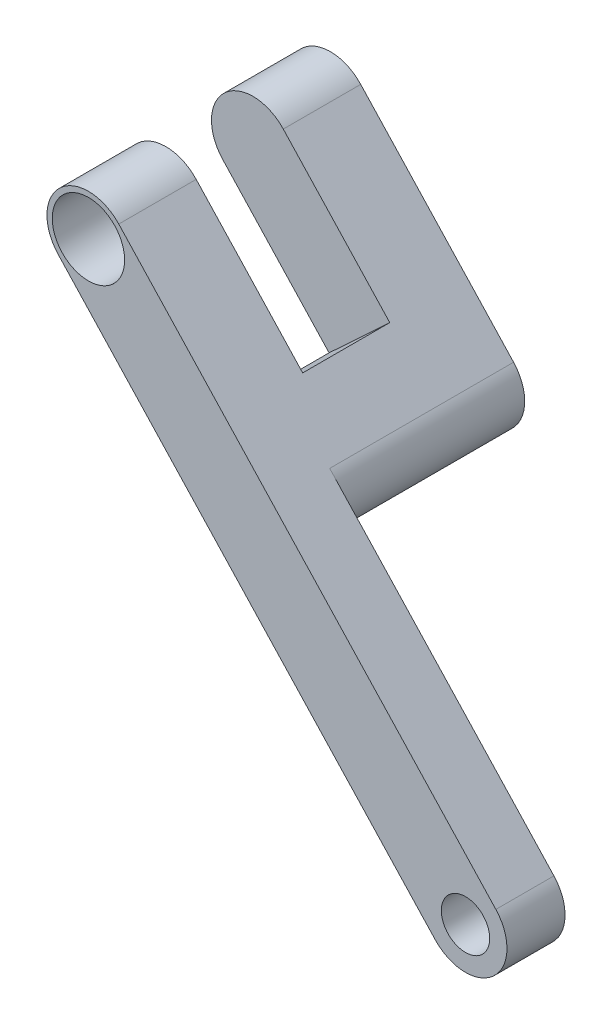
ISO-10303-21;
HEADER;
FILE_DESCRIPTION(('STEP AP214'),'2;1');
FILE_NAME('part.step','',(''),(''),'','','');
FILE_SCHEMA(('AUTOMOTIVE_DESIGN { 1 0 10303 214 1 1 1 1 }'));
ENDSEC;
DATA;
#1=APPLICATION_CONTEXT('core data for automotive mechanical design processes');
#2=APPLICATION_PROTOCOL_DEFINITION('international standard','automotive_design',2000,#1);
#3=PRODUCT_CONTEXT('',#1,'mechanical');
#4=PRODUCT('Part','Part','',(#3));
#5=PRODUCT_RELATED_PRODUCT_CATEGORY('part','',(#4));
#6=PRODUCT_DEFINITION_FORMATION('','',#4);
#7=PRODUCT_DEFINITION_CONTEXT('part definition',#1,'design');
#8=PRODUCT_DEFINITION('design','',#6,#7);
#9=PRODUCT_DEFINITION_SHAPE('','',#8);
#10=(LENGTH_UNIT() NAMED_UNIT(*) SI_UNIT(.MILLI.,.METRE.));
#11=(NAMED_UNIT(*) PLANE_ANGLE_UNIT() SI_UNIT($,.RADIAN.));
#12=(NAMED_UNIT(*) SI_UNIT($,.STERADIAN.) SOLID_ANGLE_UNIT());
#13=UNCERTAINTY_MEASURE_WITH_UNIT(LENGTH_MEASURE(1.E-05),#10,'distance_accuracy_value','');
#14=(GEOMETRIC_REPRESENTATION_CONTEXT(3) GLOBAL_UNCERTAINTY_ASSIGNED_CONTEXT((#13)) GLOBAL_UNIT_ASSIGNED_CONTEXT((#10,
#11,#12)) REPRESENTATION_CONTEXT('',''));
#15=CARTESIAN_POINT('',(0.,0.,0.));
#16=DIRECTION('',(0.,0.,1.));
#17=DIRECTION('',(1.,0.,0.));
#18=AXIS2_PLACEMENT_3D('',#15,#16,#17);
#19=CARTESIAN_POINT('',(27.7336179918947,-37.6650889723921,4.));
#20=DIRECTION('',(0.,0.,-1.));
#21=DIRECTION('',(-1.,0.,0.));
#22=AXIS2_PLACEMENT_3D('',#19,#20,#21);
#23=CYLINDRICAL_SURFACE('',#22,2.14240467091107);
#24=CARTESIAN_POINT('',(27.7336179918947,-37.6650889723921,1.));
#25=DIRECTION('',(0.,0.,1.));
#26=DIRECTION('',(1.,0.,0.));
#27=AXIS2_PLACEMENT_3D('',#24,#25,#26);
#28=CIRCLE('',#27,2.14240467091107);
#29=CARTESIAN_POINT('',(26.1656181410229,-39.1249774070362,1.));
#30=VERTEX_POINT('',#29);
#31=CARTESIAN_POINT('',(29.3016178427665,-36.205200537748,1.));
#32=VERTEX_POINT('',#31);
#33=EDGE_CURVE('E129',#30,#32,#28,.T.);
#34=ORIENTED_EDGE('',*,*,#33,.F.);
#35=DIRECTION('',(0.,0.,-1.));
#36=VECTOR('',#35,1.);
#37=CARTESIAN_POINT('',(26.1656181410229,-39.1249774070362,4.));
#38=LINE('',#37,#36);
#39=CARTESIAN_POINT('',(26.1656181410229,-39.1249774070362,-8.5));
#40=VERTEX_POINT('',#39);
#41=EDGE_CURVE('E45',#30,#40,#38,.T.);
#42=ORIENTED_EDGE('',*,*,#41,.T.);
#43=CARTESIAN_POINT('',(27.7336179918947,-37.6650889723921,-8.5));
#44=DIRECTION('',(0.,0.,-1.));
#45=DIRECTION('',(-1.,0.,0.));
#46=AXIS2_PLACEMENT_3D('',#43,#44,#45);
#47=CIRCLE('',#46,2.14240467091107);
#48=CARTESIAN_POINT('',(29.3016178427665,-36.205200537748,-8.5));
#49=VERTEX_POINT('',#48);
#50=EDGE_CURVE('E146',#49,#40,#47,.T.);
#51=ORIENTED_EDGE('',*,*,#50,.F.);
#52=DIRECTION('',(0.,0.,-1.));
#53=VECTOR('',#52,1.);
#54=CARTESIAN_POINT('',(29.3016178427665,-36.205200537748,4.));
#55=LINE('',#54,#53);
#56=EDGE_CURVE('E201',#32,#49,#55,.T.);
#57=ORIENTED_EDGE('',*,*,#56,.F.);
#58=EDGE_LOOP('',(#34,#42,#51,#57));
#59=FACE_BOUND('',#58,.T.);
#60=ADVANCED_FACE('F37',(#59),#23,.T.);
#61=CARTESIAN_POINT('',(19.8350002480584,-29.1815424557379,0.));
#62=DIRECTION('',(0.,0.,1.));
#63=DIRECTION('',(1.,0.,0.));
#64=AXIS2_PLACEMENT_3D('',#61,#62,#63);
#65=PLANE('',#64);
#66=CARTESIAN_POINT('',(19.8350002480584,-29.1815424557379,0.));
#67=DIRECTION('',(0.,0.,1.));
#68=DIRECTION('',(1.,0.,0.));
#69=AXIS2_PLACEMENT_3D('',#66,#67,#68);
#70=CIRCLE('',#69,1.86939448326171);
#71=CARTESIAN_POINT('',(21.7043947313201,-29.1815424557379,0.));
#72=VERTEX_POINT('',#71);
#73=EDGE_CURVE('E179',#72,#72,#70,.T.);
#74=ORIENTED_EDGE('',*,*,#73,.T.);
#75=EDGE_LOOP('',(#74));
#76=FACE_BOUND('',#75,.T.);
#77=DIRECTION('',(0.731887804466461,0.681425154858011,0.));
#78=VECTOR('',#77,1.);
#79=CARTESIAN_POINT('',(23.7688324008696,-36.5506987197417,0.));
#80=LINE('',#79,#78);
#81=CARTESIAN_POINT('',(23.7688324008696,-36.5506987197417,0.));
#82=VERTEX_POINT('',#81);
#83=CARTESIAN_POINT('',(26.9048321026132,-33.6309218504535,0.));
#84=VERTEX_POINT('',#83);
#85=EDGE_CURVE('E60',#82,#84,#80,.T.);
#86=ORIENTED_EDGE('',*,*,#85,.F.);
#87=DIRECTION('',(0.681425154858011,-0.73188780446646,0.));
#88=VECTOR('',#87,1.);
#89=CARTESIAN_POINT('',(18.2670003971866,-30.641430890382,0.));
#90=LINE('',#89,#88);
#91=CARTESIAN_POINT('',(18.2670003971866,-30.641430890382,0.));
#92=VERTEX_POINT('',#91);
#93=EDGE_CURVE('E196',#92,#82,#90,.T.);
#94=ORIENTED_EDGE('',*,*,#93,.F.);
#95=CARTESIAN_POINT('',(19.8350002480584,-29.1815424557379,0.));
#96=DIRECTION('',(0.,0.,1.));
#97=DIRECTION('',(1.,0.,0.));
#98=AXIS2_PLACEMENT_3D('',#95,#96,#97);
#99=CIRCLE('',#98,2.14240467091107);
#100=CARTESIAN_POINT('',(21.4030000989302,-27.7216540210938,0.));
#101=VERTEX_POINT('',#100);
#102=EDGE_CURVE('E183',#101,#92,#99,.T.);
#103=ORIENTED_EDGE('',*,*,#102,.F.);
#104=DIRECTION('',(-0.681425154858011,0.731887804466461,0.));
#105=VECTOR('',#104,1.);
#106=CARTESIAN_POINT('',(21.4030000989302,-27.7216540210938,0.));
#107=LINE('',#106,#105);
#108=EDGE_CURVE('E190',#84,#101,#107,.T.);
#109=ORIENTED_EDGE('',*,*,#108,.F.);
#110=EDGE_LOOP('',(#86,#94,#103,#109));
#111=FACE_BOUND('',#110,.T.);
#112=ADVANCED_FACE('F227',(#76,#111),#65,.F.);
#113=CARTESIAN_POINT('',(19.8350002480584,-29.1815424557379,4.));
#114=DIRECTION('',(0.,0.,1.));
#115=DIRECTION('',(1.,0.,0.));
#116=AXIS2_PLACEMENT_3D('',#113,#114,#115);
#117=PLANE('',#116);
#118=DIRECTION('',(0.681425154858011,-0.73188780446646,0.));
#119=VECTOR('',#118,1.);
#120=CARTESIAN_POINT('',(18.2670003971866,-30.641430890382,4.));
#121=LINE('',#120,#119);
#122=CARTESIAN_POINT('',(18.2670003971866,-30.641430890382,4.));
#123=VERTEX_POINT('',#122);
#124=CARTESIAN_POINT('',(37.7498457736091,-51.567070082966,4.));
#125=VERTEX_POINT('',#124);
#126=EDGE_CURVE('E189',#123,#125,#121,.T.);
#127=ORIENTED_EDGE('',*,*,#126,.T.);
#128=CARTESIAN_POINT('',(39.3178456244809,-50.1071816483219,4.));
#129=DIRECTION('',(0.,0.,1.));
#130=DIRECTION('',(1.,0.,0.));
#131=AXIS2_PLACEMENT_3D('',#128,#129,#130);
#132=CIRCLE('',#131,2.14240467091107);
#133=CARTESIAN_POINT('',(40.8858454753527,-48.6472932136778,4.));
#134=VERTEX_POINT('',#133);
#135=EDGE_CURVE('E134',#125,#134,#132,.T.);
#136=ORIENTED_EDGE('',*,*,#135,.T.);
#137=DIRECTION('',(-0.681425154858011,0.731887804466461,0.));
#138=VECTOR('',#137,1.);
#139=CARTESIAN_POINT('',(21.4030000989302,-27.7216540210938,4.));
#140=LINE('',#139,#138);
#141=CARTESIAN_POINT('',(21.4030000989302,-27.7216540210938,4.));
#142=VERTEX_POINT('',#141);
#143=EDGE_CURVE('E115',#134,#142,#140,.T.);
#144=ORIENTED_EDGE('',*,*,#143,.T.);
#145=CARTESIAN_POINT('',(19.8350002480584,-29.1815424557379,4.));
#146=DIRECTION('',(0.,0.,1.));
#147=DIRECTION('',(1.,0.,0.));
#148=AXIS2_PLACEMENT_3D('',#145,#146,#147);
#149=CIRCLE('',#148,2.14240467091107);
#150=EDGE_CURVE('E186',#142,#123,#149,.T.);
#151=ORIENTED_EDGE('',*,*,#150,.T.);
#152=EDGE_LOOP('',(#127,#136,#144,#151));
#153=FACE_BOUND('',#152,.T.);
#154=CARTESIAN_POINT('',(19.8350002480584,-29.1815424557379,4.));
#155=DIRECTION('',(0.,0.,1.));
#156=DIRECTION('',(1.,0.,0.));
#157=AXIS2_PLACEMENT_3D('',#154,#155,#156);
#158=CIRCLE('',#157,1.86939448326171);
#159=CARTESIAN_POINT('',(21.7043947313201,-29.1815424557379,4.));
#160=VERTEX_POINT('',#159);
#161=EDGE_CURVE('E180',#160,#160,#158,.T.);
#162=ORIENTED_EDGE('',*,*,#161,.F.);
#163=EDGE_LOOP('',(#162));
#164=FACE_BOUND('',#163,.T.);
#165=CARTESIAN_POINT('',(39.3178456244809,-50.1071816483219,4.));
#166=DIRECTION('',(0.,0.,1.));
#167=DIRECTION('',(1.,0.,0.));
#168=AXIS2_PLACEMENT_3D('',#165,#166,#167);
#169=CIRCLE('',#168,1.25);
#170=CARTESIAN_POINT('',(40.5678456244809,-50.1071816483219,4.));
#171=VERTEX_POINT('',#170);
#172=EDGE_CURVE('E139',#171,#171,#169,.T.);
#173=ORIENTED_EDGE('',*,*,#172,.F.);
#174=EDGE_LOOP('',(#173));
#175=FACE_BOUND('',#174,.T.);
#176=ADVANCED_FACE('F229',(#153,#164,#175),#117,.T.);
#177=CARTESIAN_POINT('',(19.8350002480584,-29.1815424557379,4.));
#178=DIRECTION('',(0.,0.,-1.));
#179=DIRECTION('',(-1.,0.,0.));
#180=AXIS2_PLACEMENT_3D('',#177,#178,#179);
#181=CYLINDRICAL_SURFACE('',#180,2.14240467091107);
#182=ORIENTED_EDGE('',*,*,#102,.T.);
#183=DIRECTION('',(0.,0.,-1.));
#184=VECTOR('',#183,1.);
#185=CARTESIAN_POINT('',(18.2670003971866,-30.641430890382,4.));
#186=LINE('',#185,#184);
#187=EDGE_CURVE('E11',#123,#92,#186,.T.);
#188=ORIENTED_EDGE('',*,*,#187,.F.);
#189=ORIENTED_EDGE('',*,*,#150,.F.);
#190=DIRECTION('',(0.,0.,-1.));
#191=VECTOR('',#190,1.);
#192=CARTESIAN_POINT('',(21.4030000989302,-27.7216540210938,4.));
#193=LINE('',#192,#191);
#194=EDGE_CURVE('E193',#142,#101,#193,.T.);
#195=ORIENTED_EDGE('',*,*,#194,.T.);
#196=EDGE_LOOP('',(#182,#188,#189,#195));
#197=FACE_BOUND('',#196,.T.);
#198=ADVANCED_FACE('F39',(#197),#181,.T.);
#199=CARTESIAN_POINT('',(18.2670003971866,-30.641430890382,4.));
#200=DIRECTION('',(0.73188780446646,0.681425154858011,0.));
#201=DIRECTION('',(-0.681425154858011,0.73188780446646,0.));
#202=AXIS2_PLACEMENT_3D('',#199,#200,#201);
#203=PLANE('',#202);
#204=ORIENTED_EDGE('',*,*,#93,.T.);
#205=DIRECTION('',(0.,0.,1.));
#206=VECTOR('',#205,1.);
#207=CARTESIAN_POINT('',(23.7688324008696,-36.5506987197417,-4.5));
#208=LINE('',#207,#206);
#209=CARTESIAN_POINT('',(23.7688324008696,-36.5506987197417,-4.5));
#210=VERTEX_POINT('',#209);
#211=EDGE_CURVE('E176',#210,#82,#208,.T.);
#212=ORIENTED_EDGE('',*,*,#211,.F.);
#213=DIRECTION('',(-0.681425154858011,0.73188780446646,0.));
#214=VECTOR('',#213,1.);
#215=CARTESIAN_POINT('',(23.7688324008696,-36.5506987197417,-4.5));
#216=LINE('',#215,#214);
#217=CARTESIAN_POINT('',(18.2670003971866,-30.641430890382,-4.5));
#218=VERTEX_POINT('',#217);
#219=EDGE_CURVE('E145',#210,#218,#216,.T.);
#220=ORIENTED_EDGE('',*,*,#219,.T.);
#221=DIRECTION('',(0.,0.,1.));
#222=VECTOR('',#221,1.);
#223=CARTESIAN_POINT('',(18.2670003971866,-30.641430890382,-8.5));
#224=LINE('',#223,#222);
#225=CARTESIAN_POINT('',(18.2670003971866,-30.641430890382,-8.5));
#226=VERTEX_POINT('',#225);
#227=EDGE_CURVE('E166',#226,#218,#224,.T.);
#228=ORIENTED_EDGE('',*,*,#227,.F.);
#229=DIRECTION('',(-0.681425154858011,0.731887804466461,0.));
#230=VECTOR('',#229,1.);
#231=CARTESIAN_POINT('',(26.1656181410229,-39.1249774070362,-8.5));
#232=LINE('',#231,#230);
#233=EDGE_CURVE('E149',#40,#226,#232,.T.);
#234=ORIENTED_EDGE('',*,*,#233,.F.);
#235=ORIENTED_EDGE('',*,*,#41,.F.);
#236=DIRECTION('',(0.681425154858011,-0.73188780446646,0.));
#237=VECTOR('',#236,1.);
#238=CARTESIAN_POINT('',(37.7498457736091,-51.567070082966,1.));
#239=LINE('',#238,#237);
#240=CARTESIAN_POINT('',(37.7498457736091,-51.567070082966,1.));
#241=VERTEX_POINT('',#240);
#242=EDGE_CURVE('E121',#30,#241,#239,.T.);
#243=ORIENTED_EDGE('',*,*,#242,.T.);
#244=DIRECTION('',(0.,0.,1.));
#245=VECTOR('',#244,1.);
#246=CARTESIAN_POINT('',(37.7498457736091,-51.567070082966,1.));
#247=LINE('',#246,#245);
#248=EDGE_CURVE('E120',#241,#125,#247,.T.);
#249=ORIENTED_EDGE('',*,*,#248,.T.);
#250=ORIENTED_EDGE('',*,*,#126,.F.);
#251=ORIENTED_EDGE('',*,*,#187,.T.);
#252=EDGE_LOOP('',(#204,#212,#220,#228,#234,#235,#243,#249,#250,#251));
#253=FACE_BOUND('',#252,.T.);
#254=ADVANCED_FACE('F208',(#253),#203,.F.);
#255=CARTESIAN_POINT('',(21.4030000989302,-27.7216540210938,4.));
#256=DIRECTION('',(-0.731887804466461,-0.681425154858011,0.));
#257=DIRECTION('',(0.681425154858011,-0.731887804466461,0.));
#258=AXIS2_PLACEMENT_3D('',#255,#256,#257);
#259=PLANE('',#258);
#260=ORIENTED_EDGE('',*,*,#143,.F.);
#261=DIRECTION('',(0.,0.,1.));
#262=VECTOR('',#261,1.);
#263=CARTESIAN_POINT('',(40.8858454753527,-48.6472932136778,1.));
#264=LINE('',#263,#262);
#265=CARTESIAN_POINT('',(40.8858454753527,-48.6472932136778,1.));
#266=VERTEX_POINT('',#265);
#267=EDGE_CURVE('E112',#266,#134,#264,.T.);
#268=ORIENTED_EDGE('',*,*,#267,.F.);
#269=DIRECTION('',(-0.68142515485801,0.731887804466462,0.));
#270=VECTOR('',#269,1.);
#271=CARTESIAN_POINT('',(40.8858454753527,-48.6472932136778,1.));
#272=LINE('',#271,#270);
#273=EDGE_CURVE('E52',#266,#32,#272,.T.);
#274=ORIENTED_EDGE('',*,*,#273,.T.);
#275=ORIENTED_EDGE('',*,*,#56,.T.);
#276=DIRECTION('',(0.681425154858011,-0.731887804466461,0.));
#277=VECTOR('',#276,1.);
#278=CARTESIAN_POINT('',(21.4030000989302,-27.7216540210938,-8.5));
#279=LINE('',#278,#277);
#280=CARTESIAN_POINT('',(21.4030000989302,-27.7216540210938,-8.5));
#281=VERTEX_POINT('',#280);
#282=EDGE_CURVE('E154',#281,#49,#279,.T.);
#283=ORIENTED_EDGE('',*,*,#282,.F.);
#284=DIRECTION('',(0.,0.,1.));
#285=VECTOR('',#284,1.);
#286=CARTESIAN_POINT('',(21.4030000989302,-27.7216540210938,-8.5));
#287=LINE('',#286,#285);
#288=CARTESIAN_POINT('',(21.4030000989302,-27.7216540210938,-4.5));
#289=VERTEX_POINT('',#288);
#290=EDGE_CURVE('E157',#281,#289,#287,.T.);
#291=ORIENTED_EDGE('',*,*,#290,.T.);
#292=DIRECTION('',(0.681425154858011,-0.73188780446646,0.));
#293=VECTOR('',#292,1.);
#294=CARTESIAN_POINT('',(26.9048321026132,-33.6309218504535,-4.5));
#295=LINE('',#294,#293);
#296=CARTESIAN_POINT('',(26.9048321026132,-33.6309218504535,-4.5));
#297=VERTEX_POINT('',#296);
#298=EDGE_CURVE('E150',#289,#297,#295,.T.);
#299=ORIENTED_EDGE('',*,*,#298,.T.);
#300=DIRECTION('',(0.,0.,1.));
#301=VECTOR('',#300,1.);
#302=CARTESIAN_POINT('',(26.9048321026132,-33.6309218504535,-4.5));
#303=LINE('',#302,#301);
#304=EDGE_CURVE('E172',#297,#84,#303,.T.);
#305=ORIENTED_EDGE('',*,*,#304,.T.);
#306=ORIENTED_EDGE('',*,*,#108,.T.);
#307=ORIENTED_EDGE('',*,*,#194,.F.);
#308=EDGE_LOOP('',(#260,#268,#274,#275,#283,#291,#299,#305,#306,#307));
#309=FACE_BOUND('',#308,.T.);
#310=ADVANCED_FACE('F113',(#309),#259,.F.);
#311=CARTESIAN_POINT('',(19.8350002480584,-29.1815424557379,4.));
#312=DIRECTION('',(0.,0.,-1.));
#313=DIRECTION('',(-1.,0.,0.));
#314=AXIS2_PLACEMENT_3D('',#311,#312,#313);
#315=CYLINDRICAL_SURFACE('',#314,1.86939448326171);
#316=ORIENTED_EDGE('',*,*,#161,.T.);
#317=EDGE_LOOP('',(#316));
#318=FACE_BOUND('',#317,.T.);
#319=ORIENTED_EDGE('',*,*,#73,.F.);
#320=EDGE_LOOP('',(#319));
#321=FACE_BOUND('',#320,.T.);
#322=ADVANCED_FACE('F263',(#318,#321),#315,.F.);
#323=CARTESIAN_POINT('',(23.7688324008696,-36.5506987197417,-4.5));
#324=DIRECTION('',(0.681425154858011,-0.731887804466461,0.));
#325=DIRECTION('',(0.731887804466461,0.681425154858011,0.));
#326=AXIS2_PLACEMENT_3D('',#323,#324,#325);
#327=PLANE('',#326);
#328=ORIENTED_EDGE('',*,*,#85,.T.);
#329=ORIENTED_EDGE('',*,*,#304,.F.);
#330=DIRECTION('',(0.731887804466461,0.681425154858011,0.));
#331=VECTOR('',#330,1.);
#332=CARTESIAN_POINT('',(23.7688324008696,-36.5506987197417,-4.5));
#333=LINE('',#332,#331);
#334=EDGE_CURVE('E169',#210,#297,#333,.T.);
#335=ORIENTED_EDGE('',*,*,#334,.F.);
#336=ORIENTED_EDGE('',*,*,#211,.T.);
#337=EDGE_LOOP('',(#328,#329,#335,#336));
#338=FACE_BOUND('',#337,.T.);
#339=ADVANCED_FACE('F222',(#338),#327,.F.);
#340=CARTESIAN_POINT('',(27.7336179918947,-37.6650889723921,-4.5));
#341=DIRECTION('',(0.,0.,-1.));
#342=DIRECTION('',(-1.,0.,0.));
#343=AXIS2_PLACEMENT_3D('',#340,#341,#342);
#344=PLANE('',#343);
#345=ORIENTED_EDGE('',*,*,#219,.F.);
#346=ORIENTED_EDGE('',*,*,#334,.T.);
#347=ORIENTED_EDGE('',*,*,#298,.F.);
#348=CARTESIAN_POINT('',(19.8350002480584,-29.1815424557379,-4.5));
#349=DIRECTION('',(0.,0.,-1.));
#350=DIRECTION('',(-1.,0.,0.));
#351=AXIS2_PLACEMENT_3D('',#348,#349,#350);
#352=CIRCLE('',#351,2.14240467091107);
#353=EDGE_CURVE('E159',#218,#289,#352,.T.);
#354=ORIENTED_EDGE('',*,*,#353,.F.);
#355=EDGE_LOOP('',(#345,#346,#347,#354));
#356=FACE_BOUND('',#355,.T.);
#357=ADVANCED_FACE('F219',(#356),#344,.F.);
#358=CARTESIAN_POINT('',(19.8350002480584,-29.1815424557379,-8.5));
#359=DIRECTION('',(0.,0.,1.));
#360=DIRECTION('',(1.,0.,0.));
#361=AXIS2_PLACEMENT_3D('',#358,#359,#360);
#362=CYLINDRICAL_SURFACE('',#361,2.14240467091107);
#363=ORIENTED_EDGE('',*,*,#353,.T.);
#364=ORIENTED_EDGE('',*,*,#290,.F.);
#365=CARTESIAN_POINT('',(19.8350002480584,-29.1815424557379,-8.5));
#366=DIRECTION('',(0.,0.,-1.));
#367=DIRECTION('',(-1.,0.,0.));
#368=AXIS2_PLACEMENT_3D('',#365,#366,#367);
#369=CIRCLE('',#368,2.14240467091107);
#370=EDGE_CURVE('E152',#226,#281,#369,.T.);
#371=ORIENTED_EDGE('',*,*,#370,.F.);
#372=ORIENTED_EDGE('',*,*,#227,.T.);
#373=EDGE_LOOP('',(#363,#364,#371,#372));
#374=FACE_BOUND('',#373,.T.);
#375=ADVANCED_FACE('F215',(#374),#362,.T.);
#376=CARTESIAN_POINT('',(27.7336179918947,-37.6650889723921,-8.5));
#377=DIRECTION('',(0.,0.,-1.));
#378=DIRECTION('',(-1.,0.,0.));
#379=AXIS2_PLACEMENT_3D('',#376,#377,#378);
#380=PLANE('',#379);
#381=ORIENTED_EDGE('',*,*,#50,.T.);
#382=ORIENTED_EDGE('',*,*,#233,.T.);
#383=ORIENTED_EDGE('',*,*,#370,.T.);
#384=ORIENTED_EDGE('',*,*,#282,.T.);
#385=EDGE_LOOP('',(#381,#382,#383,#384));
#386=FACE_BOUND('',#385,.T.);
#387=ADVANCED_FACE('F211',(#386),#380,.T.);
#388=CARTESIAN_POINT('',(39.3178456244809,-50.1071816483219,1.));
#389=DIRECTION('',(0.,0.,1.));
#390=DIRECTION('',(1.,0.,0.));
#391=AXIS2_PLACEMENT_3D('',#388,#389,#390);
#392=PLANE('',#391);
#393=CARTESIAN_POINT('',(39.3178456244809,-50.1071816483219,1.));
#394=DIRECTION('',(0.,0.,1.));
#395=DIRECTION('',(1.,0.,0.));
#396=AXIS2_PLACEMENT_3D('',#393,#394,#395);
#397=CIRCLE('',#396,1.25);
#398=CARTESIAN_POINT('',(40.5678456244809,-50.1071816483219,1.));
#399=VERTEX_POINT('',#398);
#400=EDGE_CURVE('E136',#399,#399,#397,.T.);
#401=ORIENTED_EDGE('',*,*,#400,.T.);
#402=EDGE_LOOP('',(#401));
#403=FACE_BOUND('',#402,.T.);
#404=ORIENTED_EDGE('',*,*,#242,.F.);
#405=ORIENTED_EDGE('',*,*,#33,.T.);
#406=ORIENTED_EDGE('',*,*,#273,.F.);
#407=CARTESIAN_POINT('',(39.3178456244809,-50.1071816483219,1.));
#408=DIRECTION('',(0.,0.,1.));
#409=DIRECTION('',(1.,0.,0.));
#410=AXIS2_PLACEMENT_3D('',#407,#408,#409);
#411=CIRCLE('',#410,2.14240467091107);
#412=EDGE_CURVE('E126',#241,#266,#411,.T.);
#413=ORIENTED_EDGE('',*,*,#412,.F.);
#414=EDGE_LOOP('',(#404,#405,#406,#413));
#415=FACE_BOUND('',#414,.T.);
#416=ADVANCED_FACE('F125',(#403,#415),#392,.F.);
#417=CARTESIAN_POINT('',(39.3178456244809,-50.1071816483219,1.));
#418=DIRECTION('',(0.,0.,1.));
#419=DIRECTION('',(1.,0.,0.));
#420=AXIS2_PLACEMENT_3D('',#417,#418,#419);
#421=CYLINDRICAL_SURFACE('',#420,2.14240467091107);
#422=ORIENTED_EDGE('',*,*,#135,.F.);
#423=ORIENTED_EDGE('',*,*,#248,.F.);
#424=ORIENTED_EDGE('',*,*,#412,.T.);
#425=ORIENTED_EDGE('',*,*,#267,.T.);
#426=EDGE_LOOP('',(#422,#423,#424,#425));
#427=FACE_BOUND('',#426,.T.);
#428=ADVANCED_FACE('F132',(#427),#421,.T.);
#429=CARTESIAN_POINT('',(39.3178456244809,-50.1071816483219,1.));
#430=DIRECTION('',(0.,0.,1.));
#431=DIRECTION('',(1.,0.,0.));
#432=AXIS2_PLACEMENT_3D('',#429,#430,#431);
#433=CYLINDRICAL_SURFACE('',#432,1.25);
#434=ORIENTED_EDGE('',*,*,#400,.F.);
#435=EDGE_LOOP('',(#434));
#436=FACE_BOUND('',#435,.T.);
#437=ORIENTED_EDGE('',*,*,#172,.T.);
#438=EDGE_LOOP('',(#437));
#439=FACE_BOUND('',#438,.T.);
#440=ADVANCED_FACE('F242',(#436,#439),#433,.F.);
#441=CLOSED_SHELL('',(#60,#112,#176,#198,#254,#310,#322,#339,#357,#375,#387,#416,#428,#440));
#442=MANIFOLD_SOLID_BREP('B2',#441);
#443=ADVANCED_BREP_SHAPE_REPRESENTATION('',(#18,#442),#14);
#444=SHAPE_DEFINITION_REPRESENTATION(#9,#443);
ENDSEC;
END-ISO-10303-21;
